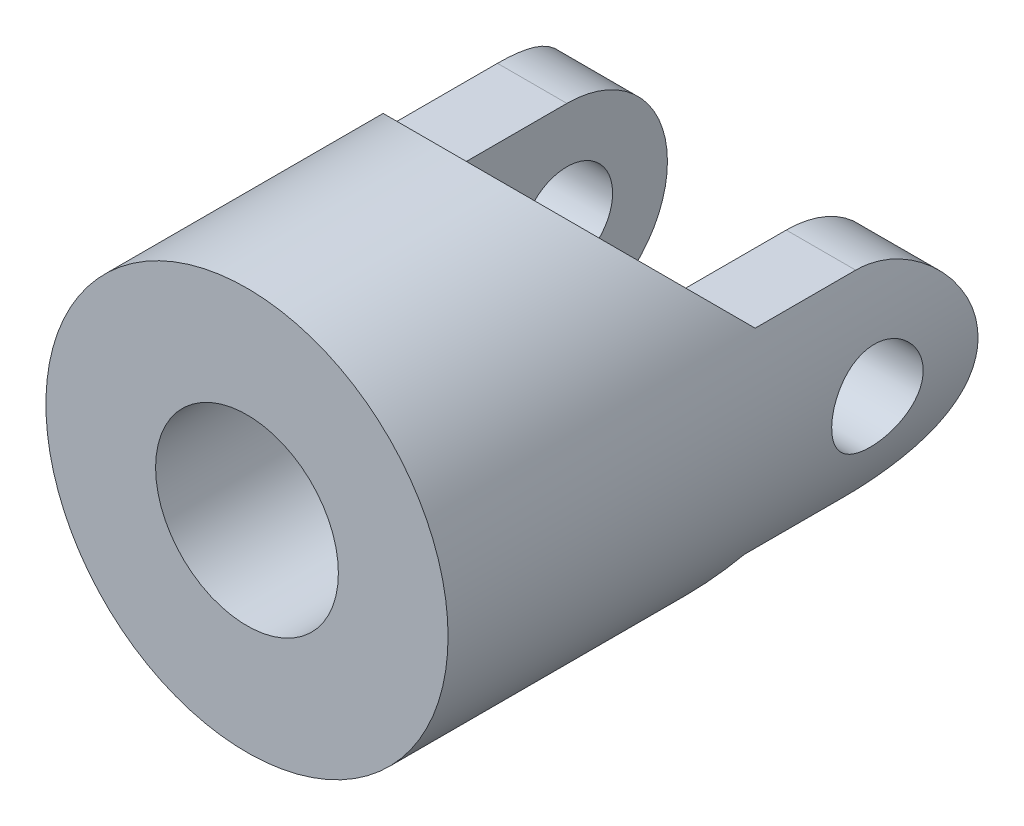
ISO-10303-21;
HEADER;
FILE_DESCRIPTION(('STEP AP214'),'2;1');
FILE_NAME('part.step','',(''),(''),'','','');
FILE_SCHEMA(('AUTOMOTIVE_DESIGN { 1 0 10303 214 1 1 1 1 }'));
ENDSEC;
DATA;
#1=APPLICATION_CONTEXT('core data for automotive mechanical design processes');
#2=APPLICATION_PROTOCOL_DEFINITION('international standard','automotive_design',2000,#1);
#3=PRODUCT_CONTEXT('',#1,'mechanical');
#4=PRODUCT('Part','Part','',(#3));
#5=PRODUCT_RELATED_PRODUCT_CATEGORY('part','',(#4));
#6=PRODUCT_DEFINITION_FORMATION('','',#4);
#7=PRODUCT_DEFINITION_CONTEXT('part definition',#1,'design');
#8=PRODUCT_DEFINITION('design','',#6,#7);
#9=PRODUCT_DEFINITION_SHAPE('','',#8);
#10=(LENGTH_UNIT() NAMED_UNIT(*) SI_UNIT(.MILLI.,.METRE.));
#11=(NAMED_UNIT(*) PLANE_ANGLE_UNIT() SI_UNIT($,.RADIAN.));
#12=(NAMED_UNIT(*) SI_UNIT($,.STERADIAN.) SOLID_ANGLE_UNIT());
#13=UNCERTAINTY_MEASURE_WITH_UNIT(LENGTH_MEASURE(1.E-05),#10,'distance_accuracy_value','');
#14=(GEOMETRIC_REPRESENTATION_CONTEXT(3) GLOBAL_UNCERTAINTY_ASSIGNED_CONTEXT((#13)) GLOBAL_UNIT_ASSIGNED_CONTEXT((#10,
#11,#12)) REPRESENTATION_CONTEXT('',''));
#15=CARTESIAN_POINT('',(0.,0.,0.));
#16=DIRECTION('',(0.,0.,1.));
#17=DIRECTION('',(1.,0.,0.));
#18=AXIS2_PLACEMENT_3D('',#15,#16,#17);
#19=CARTESIAN_POINT('',(0.,0.,29.));
#20=DIRECTION('',(0.,0.,-1.));
#21=DIRECTION('',(-1.,0.,0.));
#22=AXIS2_PLACEMENT_3D('',#19,#20,#21);
#23=CYLINDRICAL_SURFACE('',#22,11.);
#24=CARTESIAN_POINT('',(0.,0.,29.));
#25=DIRECTION('',(0.,0.,1.));
#26=DIRECTION('',(1.,0.,0.));
#27=AXIS2_PLACEMENT_3D('',#24,#25,#26);
#28=CIRCLE('',#27,11.);
#29=CARTESIAN_POINT('',(11.,0.,29.));
#30=VERTEX_POINT('',#29);
#31=EDGE_CURVE('E179',#30,#30,#28,.T.);
#32=ORIENTED_EDGE('',*,*,#31,.F.);
#33=EDGE_LOOP('',(#32));
#34=FACE_BOUND('',#33,.T.);
#35=DIRECTION('',(0.,0.,-1.));
#36=VECTOR('',#35,1.);
#37=CARTESIAN_POINT('',(-9.79795897113271,5.,29.));
#38=LINE('',#37,#36);
#39=CARTESIAN_POINT('',(-9.79795897113271,5.,5.50000000000001));
#40=VERTEX_POINT('',#39);
#41=CARTESIAN_POINT('',(-9.79795897113269,5.,11.));
#42=VERTEX_POINT('',#41);
#43=EDGE_CURVE('E175',#40,#42,#38,.F.);
#44=ORIENTED_EDGE('',*,*,#43,.F.);
#45=CARTESIAN_POINT('',(-9.79795897113271,5.,5.5));
#46=CARTESIAN_POINT('',(-9.79791901495704,5.00002536693657,5.35375448692618));
#47=CARTESIAN_POINT('',(-9.80093435512819,4.99416817861175,5.20752638082429));
#48=CARTESIAN_POINT('',(-9.81277951302113,4.97088215506113,4.91630510558793));
#49=CARTESIAN_POINT('',(-9.82160631764494,4.95345931629522,4.77131133592007));
#50=CARTESIAN_POINT('',(-9.84472045361108,4.90735159158612,4.48433011762093));
#51=CARTESIAN_POINT('',(-9.85898003581049,4.87872391691164,4.34233119912725));
#52=CARTESIAN_POINT('',(-9.89243088582325,4.81053645935873,4.06157315381756));
#53=CARTESIAN_POINT('',(-9.91162261297716,4.77097565823039,3.9228143300718));
#54=CARTESIAN_POINT('',(-9.95424066922814,4.68140372944851,3.64968436053223));
#55=CARTESIAN_POINT('',(-9.97765878065315,4.63141285283372,3.515305287167));
#56=CARTESIAN_POINT('',(-10.0280015554786,4.52137658634203,3.25139025618155));
#57=CARTESIAN_POINT('',(-10.0549275445201,4.46132739292306,3.1218561534353));
#58=CARTESIAN_POINT('',(-10.1398192078454,4.26662892993911,2.74130640074443));
#59=CARTESIAN_POINT('',(-10.2018810262926,4.11746378831441,2.49844914766621));
#60=CARTESIAN_POINT('',(-10.3344879250292,3.77289084936972,2.02374332069485));
#61=CARTESIAN_POINT('',(-10.4053228998938,3.57502224647574,1.79377659115899));
#62=CARTESIAN_POINT('',(-10.5437212272509,3.14342624253717,1.3687778516989));
#63=CARTESIAN_POINT('',(-10.6112840246141,2.90969278481333,1.17375175445627));
#64=CARTESIAN_POINT('',(-10.7058012373936,2.53059272892566,0.907521391384928));
#65=CARTESIAN_POINT('',(-10.7367467983721,2.39629328157212,0.821645318034693));
#66=CARTESIAN_POINT('',(-10.7946726215094,2.1201187682204,0.661569608717118));
#67=CARTESIAN_POINT('',(-10.8216546456735,1.97824710695397,0.587364783208756));
#68=CARTESIAN_POINT('',(-10.8707064729916,1.68801380817859,0.451409936999834));
#69=CARTESIAN_POINT('',(-10.8927809274941,1.53965847682705,0.389648128178017));
#70=CARTESIAN_POINT('',(-10.9312326033996,1.23746835060458,0.27917028695496));
#71=CARTESIAN_POINT('',(-10.9476113679389,1.08363505235314,0.230450721836414));
#72=CARTESIAN_POINT('',(-10.9706154567375,0.811869404333418,0.157397441251613));
#73=CARTESIAN_POINT('',(-10.9786654638073,0.694866193159206,0.130014367818682));
#74=CARTESIAN_POINT('',(-10.9910468923933,0.45914376663639,0.0829452088339087));
#75=CARTESIAN_POINT('',(-10.9953791200909,0.340424928993014,0.0632574550961064));
#76=CARTESIAN_POINT('',(-11.0001785420311,0.101664552980263,0.0316805119713146));
#77=CARTESIAN_POINT('',(-11.0006389090476,-0.0183789482440031,0.0198051320519487));
#78=CARTESIAN_POINT('',(-10.997612691706,-0.258977433874118,0.00395752416385313));
#79=CARTESIAN_POINT('',(-10.9941247664844,-0.379532578181629,-1.20176716498572E-05));
#80=CARTESIAN_POINT('',(-10.988630487918,-0.500000000000001,0.));
#81=B_SPLINE_CURVE_WITH_KNOTS('',3,(#45,#46,#47,#48,#49,#50,#51,#52,#53,#54,#55,#56,#57,#58,#59,
#60,#61,#62,#63,#64,#65,#66,#67,#68,#69,#70,#71,#72,#73,#74,#75,#76,#77,#78,#79,#80),
.UNSPECIFIED.,.F.,.F.,(4,2,2,2,2,2,2,2,2,2,2,2,2,2,2,2,2,4),(0.,0.438560770792847,
0.876894337743148,1.31301839758024,1.74918308925664,2.18450867554247,2.61999925293241,
3.49131517536416,4.42208376225702,5.35300970608816,5.83962820390414,6.32602971467,
6.81196823443102,7.29777499584993,7.65878405657226,8.01971481454474,8.38128186618592,
8.74297174499438),.UNSPECIFIED.);
#82=CARTESIAN_POINT('',(-10.988630487918,-0.500000000000004,0.));
#83=VERTEX_POINT('',#82);
#84=EDGE_CURVE('E228',#40,#83,#81,.T.);
#85=ORIENTED_EDGE('',*,*,#84,.T.);
#86=CARTESIAN_POINT('',(-10.988630487918,-0.500000000000004,0.));
#87=CARTESIAN_POINT('',(-10.981968021013,-0.647026486825968,-2.46735024511314E-05));
#88=CARTESIAN_POINT('',(-10.972301902938,-0.793897223235127,0.0058942229554735));
#89=CARTESIAN_POINT('',(-10.9472203288064,-1.08614141915329,0.029365375815211));
#90=CARTESIAN_POINT('',(-10.9318076926036,-1.23151557714831,0.0469119297271468));
#91=CARTESIAN_POINT('',(-10.8955732554246,-1.51901909889787,0.0932709149344862));
#92=CARTESIAN_POINT('',(-10.8747784031137,-1.66116089580998,0.122027570532244));
#93=CARTESIAN_POINT('',(-10.828159221419,-1.94196253606492,0.190421334915883));
#94=CARTESIAN_POINT('',(-10.8023344508309,-2.08062207275235,0.230059398300527));
#95=CARTESIAN_POINT('',(-10.746216602144,-2.35333187275217,0.319679342973049));
#96=CARTESIAN_POINT('',(-10.7159317924615,-2.48739011110855,0.369642150999976));
#97=CARTESIAN_POINT('',(-10.6514525596963,-2.75044207128096,0.479457474736101));
#98=CARTESIAN_POINT('',(-10.6172566756679,-2.87943387624802,0.539313689777014));
#99=CARTESIAN_POINT('',(-10.5097259870652,-3.25796477113642,0.733036132312776));
#100=CARTESIAN_POINT('',(-10.4314568598866,-3.49901840396594,0.881042542696296));
#101=CARTESIAN_POINT('',(-10.2618451109196,-3.97008806405857,1.22226931156325));
#102=CARTESIAN_POINT('',(-10.1699702395628,-4.19813692645696,1.41793670203965));
#103=CARTESIAN_POINT('',(-10.0317998071262,-4.51401052180838,1.73699814480322));
#104=CARTESIAN_POINT('',(-9.98564517706542,-4.61500740478636,1.84771368648627));
#105=CARTESIAN_POINT('',(-9.89424210515607,-4.80784150839262,2.07728693669595));
#106=CARTESIAN_POINT('',(-9.84899382208696,-4.89967713512011,2.19614605601803));
#107=CARTESIAN_POINT('',(-9.75705631937896,-5.08044597622713,2.45109641677957));
#108=CARTESIAN_POINT('',(-9.71053161551891,-5.16858911540188,2.58780823858284));
#109=CARTESIAN_POINT('',(-9.62130282353169,-5.33284779687719,2.86938591839545));
#110=CARTESIAN_POINT('',(-9.57859696225822,-5.40896893388637,3.014247940704));
#111=CARTESIAN_POINT('',(-9.4985645366606,-5.54830760523412,3.31107088780564));
#112=CARTESIAN_POINT('',(-9.46122619037266,-5.61155353244038,3.46301526389547));
#113=CARTESIAN_POINT('',(-9.39330292576434,-5.72452743953693,3.77328573660333));
#114=CARTESIAN_POINT('',(-9.36271540114178,-5.77426063803093,3.93160934236492));
#115=CARTESIAN_POINT('',(-9.31745889917455,-5.84689726302115,4.20597993794358));
#116=CARTESIAN_POINT('',(-9.30075439822387,-5.873389124653,4.32075507992826));
#117=CARTESIAN_POINT('',(-9.27178239425065,-5.91901847949776,4.55228979391347));
#118=CARTESIAN_POINT('',(-9.25951362294048,-5.93815807500803,4.66904878866743));
#119=CARTESIAN_POINT('',(-9.23969468855725,-5.96895291038192,4.90444145121145));
#120=CARTESIAN_POINT('',(-9.23216414464764,-5.98057703700029,5.0230808551016));
#121=CARTESIAN_POINT('',(-9.22207550474181,-5.9961102742142,5.2611428330243));
#122=CARTESIAN_POINT('',(-9.21952035002263,-6.0000148212837,5.38056582846288));
#123=CARTESIAN_POINT('',(-9.21954445729289,-6.,5.5));
#124=B_SPLINE_CURVE_WITH_KNOTS('',3,(#86,#87,#88,#89,#90,#91,#92,#93,#94,#95,#96,#97,#98,#99,
#100,#101,#102,#103,#104,#105,#106,#107,#108,#109,#110,#111,#112,#113,#114,#115,#116,#117,#118,
#119,#120,#121,#122,#123),.UNSPECIFIED.,.F.,.F.,(4,2,2,2,2,2,2,2,2,2,2,2,2,2,2,2,2,2,4),(0.,
0.441353657171415,0.882491023658467,1.32146096999993,1.76046943839308,2.19867404706675,
2.63704288094201,3.51391108569238,4.45242141646075,4.9224508605191,5.39256193950139,
5.89947679133331,6.40615503937431,6.91170354104699,7.41705652192578,7.77367365750013,
8.13018874639893,8.48817047625676,8.84636376829054),.UNSPECIFIED.);
#125=CARTESIAN_POINT('',(-9.21954445729288,-6.,5.50000000000001));
#126=VERTEX_POINT('',#125);
#127=EDGE_CURVE('E222',#83,#126,#124,.T.);
#128=ORIENTED_EDGE('',*,*,#127,.T.);
#129=DIRECTION('',(0.,0.,-1.));
#130=VECTOR('',#129,1.);
#131=CARTESIAN_POINT('',(-9.21954445729288,-6.,29.));
#132=LINE('',#131,#130);
#133=CARTESIAN_POINT('',(-9.21954445729287,-6.,11.));
#134=VERTEX_POINT('',#133);
#135=EDGE_CURVE('E172',#134,#126,#132,.T.);
#136=ORIENTED_EDGE('',*,*,#135,.F.);
#137=CARTESIAN_POINT('',(0.,0.,5.00000000000005));
#138=DIRECTION('',(0.,-0.707106781186546,-0.707106781186549));
#139=DIRECTION('',(0.,0.707106781186549,-0.707106781186546));
#140=AXIS2_PLACEMENT_3D('',#137,#138,#139);
#141=ELLIPSE('',#140,15.556349186104,11.);
#142=CARTESIAN_POINT('',(9.21954445729289,-6.,11.));
#143=VERTEX_POINT('',#142);
#144=EDGE_CURVE('E182',#143,#134,#141,.T.);
#145=ORIENTED_EDGE('',*,*,#144,.F.);
#146=DIRECTION('',(0.,0.,-1.));
#147=VECTOR('',#146,1.);
#148=CARTESIAN_POINT('',(9.21954445729288,-6.,29.));
#149=LINE('',#148,#147);
#150=CARTESIAN_POINT('',(9.21954445729288,-6.,5.50000000000001));
#151=VERTEX_POINT('',#150);
#152=EDGE_CURVE('E166',#151,#143,#149,.F.);
#153=ORIENTED_EDGE('',*,*,#152,.F.);
#154=CARTESIAN_POINT('',(9.21954445729288,-6.,5.5));
#155=CARTESIAN_POINT('',(9.21949745252943,-6.00002900746917,5.35844650521414));
#156=CARTESIAN_POINT('',(9.22309934976338,-5.99453666780138,5.21691663271529));
#157=CARTESIAN_POINT('',(9.23724910092051,-5.97273264809567,4.9351423967424));
#158=CARTESIAN_POINT('',(9.24779189796075,-5.95642884482774,4.79489717268762));
#159=CARTESIAN_POINT('',(9.27538035135516,-5.91336855877127,4.51764766279104));
#160=CARTESIAN_POINT('',(9.29238222264703,-5.88668242746403,4.38062801122878));
#161=CARTESIAN_POINT('',(9.33228061686796,-5.82322509401676,4.10981408309997));
#162=CARTESIAN_POINT('',(9.35517796823375,-5.78645247446931,3.9760202627214));
#163=CARTESIAN_POINT('',(9.40605412164269,-5.70337652922192,3.71286396815222));
#164=CARTESIAN_POINT('',(9.43401805579212,-5.65710103805909,3.58348981096273));
#165=CARTESIAN_POINT('',(9.49425297529968,-5.55541677809814,3.32939875554668));
#166=CARTESIAN_POINT('',(9.52652562235972,-5.50000448364515,3.20468367801342));
#167=CARTESIAN_POINT('',(9.62862016772359,-5.32058308542793,2.83804337466108));
#168=CARTESIAN_POINT('',(9.70367298148632,-5.18346094813861,2.60384675513947));
#169=CARTESIAN_POINT('',(9.86840258090261,-4.86313696178404,2.13837668605984));
#170=CARTESIAN_POINT('',(9.95879163810767,-4.67676931275557,1.90955648720308));
#171=CARTESIAN_POINT('',(10.1399283916986,-4.26981959415204,1.48441139063383));
#172=CARTESIAN_POINT('',(10.2306762271062,-4.04922266226001,1.28810068541474));
#173=CARTESIAN_POINT('',(10.3655466459146,-3.68436120707404,1.01267262461045));
#174=CARTESIAN_POINT('',(10.4122261922286,-3.55058504088419,0.920652666653367));
#175=CARTESIAN_POINT('',(10.5022773525515,-3.27462861933775,0.748383511946173));
#176=CARTESIAN_POINT('',(10.5456503133892,-3.1324518280401,0.668129510292132));
#177=CARTESIAN_POINT('',(10.6279663758417,-2.84065090860849,0.520232034113863));
#178=CARTESIAN_POINT('',(10.6669138855204,-2.69103440840638,0.452575967460876));
#179=CARTESIAN_POINT('',(10.7394158068789,-2.38528799409831,0.330594989248598));
#180=CARTESIAN_POINT('',(10.7729736653933,-2.22916232392143,0.276261545687708));
#181=CARTESIAN_POINT('',(10.8275233948264,-1.94452259786368,0.19145937144126));
#182=CARTESIAN_POINT('',(10.8496777735677,-1.81700293041331,0.158378050186886));
#183=CARTESIAN_POINT('',(10.8897018218903,-1.55929308822138,0.101360443055499));
#184=CARTESIAN_POINT('',(10.9075724644684,-1.42910352721932,0.0774220797364011));
#185=CARTESIAN_POINT('',(10.9387891942091,-1.16636989174955,0.0388990998124758));
#186=CARTESIAN_POINT('',(10.9521203874137,-1.03381954011216,0.0243451365414475));
#187=CARTESIAN_POINT('',(10.9740067048015,-0.767555171832359,0.00488467049829024));
#188=CARTESIAN_POINT('',(10.9825594162334,-0.633840601893957,-1.69617657563802E-05));
#189=CARTESIAN_POINT('',(10.988630487918,-0.500000000000004,0.));
#190=B_SPLINE_CURVE_WITH_KNOTS('',3,(#154,#155,#156,#157,#158,#159,#160,#161,#162,#163,#164,
#165,#166,#167,#168,#169,#170,#171,#172,#173,#174,#175,#176,#177,#178,#179,#180,#181,#182,#183,
#184,#185,#186,#187,#188,#189),.UNSPECIFIED.,.F.,.F.,(4,2,2,2,2,2,2,2,2,2,2,2,2,2,2,2,2,4),(0.,
0.424470802660134,0.848632693315212,1.26996913027414,1.69136480604974,2.11154335469819,
2.53188442039869,3.37327651318758,4.29569260758612,5.21851034060388,5.72480163745929,
6.23088559902172,6.73646096215697,7.24171169684039,7.64210099547243,8.04239926436079,
8.44399853663665,8.8458004016128),.UNSPECIFIED.);
#191=CARTESIAN_POINT('',(10.988630487918,-0.500000000000001,0.));
#192=VERTEX_POINT('',#191);
#193=EDGE_CURVE('E199',#151,#192,#190,.T.);
#194=ORIENTED_EDGE('',*,*,#193,.T.);
#195=CARTESIAN_POINT('',(10.988630487918,-0.500000000000001,0.));
#196=CARTESIAN_POINT('',(10.9951861811526,-0.356493024519304,-2.44521712459134E-05));
#197=CARTESIAN_POINT('',(10.998879544689,-0.212863256119073,0.00561561594683252));
#198=CARTESIAN_POINT('',(11.000679086674,0.0735071514777978,0.0281046077150079));
#199=CARTESIAN_POINT('',(10.9987870217334,0.216248056071412,0.0449500060110572));
#200=CARTESIAN_POINT('',(10.9895766114363,0.49919917301931,0.0896350914115936));
#201=CARTESIAN_POINT('',(10.9822812057621,0.639417524633493,0.11742806813122));
#202=CARTESIAN_POINT('',(10.9625994296562,0.916928804969691,0.183735852970523));
#203=CARTESIAN_POINT('',(10.9502128728256,1.05422162638764,0.222251053639077));
#204=CARTESIAN_POINT('',(10.9207764183119,1.32481756087141,0.309602300359135));
#205=CARTESIAN_POINT('',(10.9037312155645,1.45812454157196,0.358427944447479));
#206=CARTESIAN_POINT('',(10.8654900694103,1.72008323540956,0.465984613326715));
#207=CARTESIAN_POINT('',(10.8442925539081,1.8487331634274,0.52471938861392));
#208=CARTESIAN_POINT('',(10.7753133671246,2.22666195520486,0.715150834398785));
#209=CARTESIAN_POINT('',(10.7221398564971,2.46796477391759,0.861089260315746));
#210=CARTESIAN_POINT('',(10.6039865760435,2.93541269245536,1.19480809946281));
#211=CARTESIAN_POINT('',(10.5385487381854,3.16019247219989,1.38431865947214));
#212=CARTESIAN_POINT('',(10.4046049285449,3.57659567041061,1.79633935289467));
#213=CARTESIAN_POINT('',(10.3360968457096,3.76819582074042,2.01887244282226));
#214=CARTESIAN_POINT('',(10.2339864051134,4.03429556006482,2.38307797362611));
#215=CARTESIAN_POINT('',(10.1988348466544,4.12209540491511,2.51480933146789));
#216=CARTESIAN_POINT('',(10.1309421199475,4.28624381872553,2.78579130745898));
#217=CARTESIAN_POINT('',(10.0981999991419,4.36259692560768,2.92503891594637));
#218=CARTESIAN_POINT('',(10.0363050212754,4.50316348012606,3.21011045679357));
#219=CARTESIAN_POINT('',(10.0071485320574,4.56738924837608,3.3559275263545));
#220=CARTESIAN_POINT('',(9.95350217206189,4.68314713985369,3.65327007594967));
#221=CARTESIAN_POINT('',(9.92900951418153,4.73468684968585,3.80479208145643));
#222=CARTESIAN_POINT('',(9.88986823698849,4.81581988756768,4.08269010008618));
#223=CARTESIAN_POINT('',(9.87423182504465,4.84773025026167,4.20825564282456));
#224=CARTESIAN_POINT('',(9.84706965513788,4.90266809755512,4.46173676822173));
#225=CARTESIAN_POINT('',(9.83554304579422,4.92569742201832,4.58965185837154));
#226=CARTESIAN_POINT('',(9.81691898257216,4.96271682854708,4.84751891443659));
#227=CARTESIAN_POINT('',(9.80983558699126,4.97667822463845,4.97747602510825));
#228=CARTESIAN_POINT('',(9.80034155962739,4.99533021271464,5.23828491608505));
#229=CARTESIAN_POINT('',(9.79793318100375,5.00001633443309,5.36913709730409));
#230=CARTESIAN_POINT('',(9.79795897113271,5.,5.5));
#231=B_SPLINE_CURVE_WITH_KNOTS('',3,(#195,#196,#197,#198,#199,#200,#201,#202,#203,#204,#205,
#206,#207,#208,#209,#210,#211,#212,#213,#214,#215,#216,#217,#218,#219,#220,#221,#222,#223,#224,
#225,#226,#227,#228,#229,#230),.UNSPECIFIED.,.F.,.F.,(4,2,2,2,2,2,2,2,2,2,2,2,2,2,2,2,2,4),(0.,
0.43081896515463,0.861502452686735,1.29036789527557,1.71924904102391,2.14769954842482,
2.57631258489893,3.43339765538748,4.33342804501993,5.23408707219847,5.72008706690133,
6.20589388033135,6.69120445736646,7.17622409659043,7.56735052744143,7.95839588596672,
8.3506723498338,8.74313782737661),.UNSPECIFIED.);
#232=CARTESIAN_POINT('',(9.79795897113271,5.,5.50000000000001));
#233=VERTEX_POINT('',#232);
#234=EDGE_CURVE('E192',#192,#233,#231,.T.);
#235=ORIENTED_EDGE('',*,*,#234,.T.);
#236=DIRECTION('',(0.,0.,-1.));
#237=VECTOR('',#236,1.);
#238=CARTESIAN_POINT('',(9.79795897113271,5.,29.));
#239=LINE('',#238,#237);
#240=CARTESIAN_POINT('',(9.79795897113272,5.,11.));
#241=VERTEX_POINT('',#240);
#242=EDGE_CURVE('E177',#241,#233,#239,.T.);
#243=ORIENTED_EDGE('',*,*,#242,.F.);
#244=CARTESIAN_POINT('',(0.,0.,6.00000000000004));
#245=DIRECTION('',(0.,0.707106781186546,-0.707106781186549));
#246=DIRECTION('',(0.,-0.707106781186549,-0.707106781186546));
#247=AXIS2_PLACEMENT_3D('',#244,#245,#246);
#248=ELLIPSE('',#247,15.556349186104,11.);
#249=EDGE_CURVE('E185',#42,#241,#248,.T.);
#250=ORIENTED_EDGE('',*,*,#249,.F.);
#251=EDGE_LOOP('',(#44,#85,#128,#136,#145,#153,#194,#235,#243,#250));
#252=FACE_BOUND('',#251,.T.);
#253=CARTESIAN_POINT('',(11.,0.,3.05051025721682));
#254=CARTESIAN_POINT('',(10.999997845609,0.13638521322755,3.07835447624825));
#255=CARTESIAN_POINT('',(10.9974392075213,0.270494118822884,3.11762995966496));
#256=CARTESIAN_POINT('',(10.9879837812959,0.53024060270952,3.21789209522683));
#257=CARTESIAN_POINT('',(10.9810836653786,0.655871600746531,3.27889538634312));
#258=CARTESIAN_POINT('',(10.9641866199879,0.894970780465268,3.42073216769461));
#259=CARTESIAN_POINT('',(10.9541929913484,1.00845175355937,3.50154450228511));
#260=CARTESIAN_POINT('',(10.9326166549788,1.22035140135602,3.68075590419845));
#261=CARTESIAN_POINT('',(10.921034040301,1.31877095735252,3.77915394179199));
#262=CARTESIAN_POINT('',(10.8977530853023,1.4991236916079,3.99227305771748));
#263=CARTESIAN_POINT('',(10.8860551932184,1.58082640694563,4.10718934996515));
#264=CARTESIAN_POINT('',(10.8643276898795,1.72384369152116,4.34922747990389));
#265=CARTESIAN_POINT('',(10.8542980859141,1.78515817167297,4.47634937092396));
#266=CARTESIAN_POINT('',(10.837295821158,1.8856392617278,4.73937168743888));
#267=CARTESIAN_POINT('',(10.8303253066046,1.92479032748798,4.87527819971442));
#268=CARTESIAN_POINT('',(10.8204323949046,1.97965470378892,5.15188114723859));
#269=CARTESIAN_POINT('',(10.8175095514568,1.9953705983359,5.29257705264965));
#270=CARTESIAN_POINT('',(10.8161346753702,2.00280867940348,5.5724844472511));
#271=CARTESIAN_POINT('',(10.8176156329529,1.99489048360066,5.71168616551611));
#272=CARTESIAN_POINT('',(10.8246984108154,1.95608950654861,5.98673858859496));
#273=CARTESIAN_POINT('',(10.8303002095592,1.9252068453139,6.1225893109176));
#274=CARTESIAN_POINT('',(10.8448392335511,1.84153315332264,6.38677807215938));
#275=CARTESIAN_POINT('',(10.8537678171819,1.78879884470187,6.51513458735654));
#276=CARTESIAN_POINT('',(10.8737594880475,1.66294813510297,6.76125484080646));
#277=CARTESIAN_POINT('',(10.8848227934838,1.58982965020608,6.8790174943967));
#278=CARTESIAN_POINT('',(10.9077648167143,1.4239928635149,7.10246417049782));
#279=CARTESIAN_POINT('',(10.919653131492,1.33100220571664,7.20794515518292));
#280=CARTESIAN_POINT('',(10.9424215188916,1.12860995603469,7.40191407895685));
#281=CARTESIAN_POINT('',(10.9533015523802,1.019207727621,7.49040135863366));
#282=CARTESIAN_POINT('',(10.9724808561063,0.786357531334131,7.64829457855729));
#283=CARTESIAN_POINT('',(10.9807665866049,0.662840320295742,7.7176001981776));
#284=CARTESIAN_POINT('',(10.9932678120545,0.405715836074623,7.83444060012993));
#285=CARTESIAN_POINT('',(10.9974838286178,0.272109858328833,7.8819781720454));
#286=CARTESIAN_POINT('',(11.0008214035864,0.000969190405671018,7.95323382609147));
#287=CARTESIAN_POINT('',(11.000025268536,-0.13646531631707,7.9773292742342));
#288=CARTESIAN_POINT('',(10.9931048596125,-0.413286598855688,8.00235712780213));
#289=CARTESIAN_POINT('',(10.9869810502561,-0.552673203426903,8.00329155241339));
#290=CARTESIAN_POINT('',(10.9696775108347,-0.827597634667619,7.98222717762792));
#291=CARTESIAN_POINT('',(10.9585622454837,-0.963161813001906,7.96051625583142));
#292=CARTESIAN_POINT('',(10.9319953568615,-1.22852426442625,7.89539604710013));
#293=CARTESIAN_POINT('',(10.9165433794917,-1.35832206568072,7.85198498809263));
#294=CARTESIAN_POINT('',(10.8822094863211,-1.61057961964074,7.74403830345168));
#295=CARTESIAN_POINT('',(10.8632811314086,-1.73290585268913,7.67920580667272));
#296=CARTESIAN_POINT('',(10.8237022553466,-1.96503297760119,7.53044098024268));
#297=CARTESIAN_POINT('',(10.8030514275297,-2.07483163079168,7.44650524485159));
#298=CARTESIAN_POINT('',(10.7612667314845,-2.28179440503088,7.25931102440562));
#299=CARTESIAN_POINT('',(10.7401342098365,-2.37855749574643,7.15560826908573));
#300=CARTESIAN_POINT('',(10.6999281368675,-2.55335152365503,6.93309557931042));
#301=CARTESIAN_POINT('',(10.6808546381695,-2.63138198215676,6.81428525891682));
#302=CARTESIAN_POINT('',(10.6466886542689,-2.76638580694517,6.56471421024587));
#303=CARTESIAN_POINT('',(10.6315957918133,-2.82336116887183,6.43395461600827));
#304=CARTESIAN_POINT('',(10.6070156788768,-2.91435465244451,6.16418455274395));
#305=CARTESIAN_POINT('',(10.5975269967762,-2.94837863746649,6.02517620090333));
#306=CARTESIAN_POINT('',(10.5854229794632,-2.99153976208597,5.7476283673067));
#307=CARTESIAN_POINT('',(10.5825972681662,-3.00143896711196,5.60921642189325));
#308=CARTESIAN_POINT('',(10.583508881186,-2.99822356288687,5.33269237958525));
#309=CARTESIAN_POINT('',(10.5872454038863,-2.98511176456851,5.19458024813005));
#310=CARTESIAN_POINT('',(10.6007294677011,-2.93685765454005,4.92551934111751));
#311=CARTESIAN_POINT('',(10.6103522757705,-2.90217224754701,4.79448177376608));
#312=CARTESIAN_POINT('',(10.6345194918067,-2.81232017092692,4.54011700208272));
#313=CARTESIAN_POINT('',(10.6490644424918,-2.75715124270994,4.41679064977108));
#314=CARTESIAN_POINT('',(10.6820040711091,-2.62666869503394,4.17860333875161));
#315=CARTESIAN_POINT('',(10.7004700161672,-2.55097375220452,4.06396138989649));
#316=CARTESIAN_POINT('',(10.7393325260586,-2.38206455615244,3.84877288335473));
#317=CARTESIAN_POINT('',(10.7597294318829,-2.28884720574938,3.74822882303998));
#318=CARTESIAN_POINT('',(10.8013074941194,-2.08398899562686,3.56070150050589));
#319=CARTESIAN_POINT('',(10.8224926214188,-1.97184844995185,3.47426416124911));
#320=CARTESIAN_POINT('',(10.863081124014,-1.73434789197153,3.3213926845076));
#321=CARTESIAN_POINT('',(10.8824842101232,-1.60898574115378,3.25496178966089));
#322=CARTESIAN_POINT('',(10.9178861411746,-1.34801487459564,3.14393521400939));
#323=CARTESIAN_POINT('',(10.9338743731785,-1.21237593979363,3.09940706113009));
#324=CARTESIAN_POINT('',(10.9610629752306,-0.93511529692856,3.03404756082056));
#325=CARTESIAN_POINT('',(10.9722675956003,-0.793499023312404,3.01319514962867));
#326=CARTESIAN_POINT('',(10.987169194317,-0.542255898130256,2.99797802485301));
#327=CARTESIAN_POINT('',(10.9920146380483,-0.432978256659561,2.9985182451607));
#328=CARTESIAN_POINT('',(10.9984308238557,-0.215333695507557,3.01386553893774));
#329=CARTESIAN_POINT('',(11.000001689686,-0.106966741563357,3.0286720732181));
#330=CARTESIAN_POINT('',(11.,0.,3.05051025721682));
#331=B_SPLINE_CURVE_WITH_KNOTS('',3,(#253,#254,#255,#256,#257,#258,#259,#260,#261,#262,#263,
#264,#265,#266,#267,#268,#269,#270,#271,#272,#273,#274,#275,#276,#277,#278,#279,#280,#281,#282,
#283,#284,#285,#286,#287,#288,#289,#290,#291,#292,#293,#294,#295,#296,#297,#298,#299,#300,#301,
#302,#303,#304,#305,#306,#307,#308,#309,#310,#311,#312,#313,#314,#315,#316,#317,#318,#319,#320,
#321,#322,#323,#324,#325,#326,#327,#328,#329,#330),.UNSPECIFIED.,.T.,.F.,(4,2,2,2,2,2,2,2,2,2,2,
2,2,2,2,2,2,2,2,2,2,2,2,2,2,2,2,2,2,2,2,2,2,2,2,2,2,2,4),(0.,0.417193560244907,0.83470729312768,
1.2517770580714,1.66882240952812,2.09127855592384,2.51373654820925,2.93649046229911,
3.3591977592966,3.77550607074456,4.19181220654024,4.60704440503058,5.02231906919001,
5.44369919591721,5.86509567028598,6.28865611454459,6.7121622641735,7.1287321952012,
7.54526580938998,7.95656805746039,8.36790389870954,8.78519773462465,9.20256602436172,
9.63074738543135,10.0589396870294,10.4870913933746,10.915133678567,11.3294686782071,
11.7437530678532,12.1495488687702,12.55538942755,12.9693580455887,13.3833999037433,
13.810877459721,14.2384242638803,14.6672810939384,15.0957560802516,15.4229728018863,
15.7501771569959),.UNSPECIFIED.);
#332=CARTESIAN_POINT('',(11.,0.,3.05051025721682));
#333=VERTEX_POINT('',#332);
#334=EDGE_CURVE('E235',#333,#333,#331,.T.);
#335=ORIENTED_EDGE('',*,*,#334,.F.);
#336=EDGE_LOOP('',(#335));
#337=FACE_BOUND('',#336,.T.);
#338=CARTESIAN_POINT('',(-11.,0.,7.94948974278318));
#339=CARTESIAN_POINT('',(-10.999997845609,0.136385213227551,7.92164552375175));
#340=CARTESIAN_POINT('',(-10.9974392075213,0.270494118822884,7.88237004033504));
#341=CARTESIAN_POINT('',(-10.9879837812959,0.530240602709521,7.78210790477317));
#342=CARTESIAN_POINT('',(-10.9810836653786,0.655871600746531,7.72110461365688));
#343=CARTESIAN_POINT('',(-10.9641866199879,0.894970780465269,7.57926783230539));
#344=CARTESIAN_POINT('',(-10.9541929913484,1.00845175355937,7.49845549771489));
#345=CARTESIAN_POINT('',(-10.9326166549788,1.22035140135602,7.31924409580155));
#346=CARTESIAN_POINT('',(-10.921034040301,1.31877095735252,7.22084605820801));
#347=CARTESIAN_POINT('',(-10.8977530853023,1.4991236916079,7.00772694228252));
#348=CARTESIAN_POINT('',(-10.8860551932184,1.58082640694563,6.89281065003485));
#349=CARTESIAN_POINT('',(-10.8643276898795,1.72384369152117,6.65077252009611));
#350=CARTESIAN_POINT('',(-10.8542980859141,1.78515817167298,6.52365062907604));
#351=CARTESIAN_POINT('',(-10.837295821158,1.8856392617278,6.26062831256112));
#352=CARTESIAN_POINT('',(-10.8303253066046,1.92479032748798,6.12472180028558));
#353=CARTESIAN_POINT('',(-10.8204323949046,1.97965470378892,5.84811885276141));
#354=CARTESIAN_POINT('',(-10.8175095514568,1.99537059833591,5.70742294735035));
#355=CARTESIAN_POINT('',(-10.8161346753702,2.00280867940348,5.4275155527489));
#356=CARTESIAN_POINT('',(-10.8176156329529,1.99489048360066,5.28831383448389));
#357=CARTESIAN_POINT('',(-10.8246984108154,1.95608950654861,5.01326141140504));
#358=CARTESIAN_POINT('',(-10.8303002095592,1.9252068453139,4.8774106890824));
#359=CARTESIAN_POINT('',(-10.8448392335511,1.84153315332264,4.61322192784062));
#360=CARTESIAN_POINT('',(-10.8537678171819,1.78879884470187,4.48486541264346));
#361=CARTESIAN_POINT('',(-10.8737594880475,1.66294813510297,4.23874515919354));
#362=CARTESIAN_POINT('',(-10.8848227934838,1.58982965020608,4.1209825056033));
#363=CARTESIAN_POINT('',(-10.9077648167143,1.42399286351491,3.89753582950218));
#364=CARTESIAN_POINT('',(-10.919653131492,1.33100220571665,3.79205484481708));
#365=CARTESIAN_POINT('',(-10.9424215188916,1.12860995603469,3.59808592104315));
#366=CARTESIAN_POINT('',(-10.9533015523802,1.01920772762101,3.50959864136634));
#367=CARTESIAN_POINT('',(-10.9724808561063,0.786357531334134,3.35170542144271));
#368=CARTESIAN_POINT('',(-10.9807665866049,0.662840320295746,3.28239980182241));
#369=CARTESIAN_POINT('',(-10.9932678120545,0.405715836074627,3.16555939987007));
#370=CARTESIAN_POINT('',(-10.9974838286178,0.272109858328837,3.1180218279546));
#371=CARTESIAN_POINT('',(-11.0008214035864,0.000969190405674595,3.04676617390853));
#372=CARTESIAN_POINT('',(-11.000025268536,-0.136465316317067,3.0226707257658));
#373=CARTESIAN_POINT('',(-10.9931048596125,-0.413286598855685,2.99764287219787));
#374=CARTESIAN_POINT('',(-10.9869810502561,-0.5526732034269,2.99670844758661));
#375=CARTESIAN_POINT('',(-10.9696775108347,-0.827597634667615,3.01777282237208));
#376=CARTESIAN_POINT('',(-10.9585622454837,-0.963161813001903,3.03948374416858));
#377=CARTESIAN_POINT('',(-10.9319953568615,-1.22852426442624,3.10460395289987));
#378=CARTESIAN_POINT('',(-10.9165433794917,-1.35832206568071,3.14801501190737));
#379=CARTESIAN_POINT('',(-10.8822094863211,-1.61057961964073,3.25596169654832));
#380=CARTESIAN_POINT('',(-10.8632811314086,-1.73290585268912,3.32079419332728));
#381=CARTESIAN_POINT('',(-10.8237022553466,-1.96503297760118,3.46955901975731));
#382=CARTESIAN_POINT('',(-10.8030514275297,-2.07483163079168,3.55349475514841));
#383=CARTESIAN_POINT('',(-10.7612667314845,-2.28179440503088,3.74068897559437));
#384=CARTESIAN_POINT('',(-10.7401342098365,-2.37855749574642,3.84439173091427));
#385=CARTESIAN_POINT('',(-10.6999281368675,-2.55335152365503,4.06690442068958));
#386=CARTESIAN_POINT('',(-10.6808546381695,-2.63138198215675,4.18571474108318));
#387=CARTESIAN_POINT('',(-10.6466886542689,-2.76638580694517,4.43528578975413));
#388=CARTESIAN_POINT('',(-10.6315957918133,-2.82336116887183,4.56604538399173));
#389=CARTESIAN_POINT('',(-10.6070156788768,-2.91435465244451,4.83581544725604));
#390=CARTESIAN_POINT('',(-10.5975269967762,-2.94837863746648,4.97482379909667));
#391=CARTESIAN_POINT('',(-10.5854229794632,-2.99153976208597,5.2523716326933));
#392=CARTESIAN_POINT('',(-10.5825972681662,-3.00143896711196,5.39078357810675));
#393=CARTESIAN_POINT('',(-10.583508881186,-2.99822356288687,5.66730762041475));
#394=CARTESIAN_POINT('',(-10.5872454038863,-2.98511176456851,5.80541975186995));
#395=CARTESIAN_POINT('',(-10.6007294677011,-2.93685765454005,6.07448065888249));
#396=CARTESIAN_POINT('',(-10.6103522757705,-2.902172247547,6.20551822623392));
#397=CARTESIAN_POINT('',(-10.6345194918067,-2.81232017092692,6.45988299791728));
#398=CARTESIAN_POINT('',(-10.6490644424918,-2.75715124270994,6.58320935022892));
#399=CARTESIAN_POINT('',(-10.6820040711091,-2.62666869503394,6.82139666124839));
#400=CARTESIAN_POINT('',(-10.7004700161672,-2.55097375220452,6.93603861010351));
#401=CARTESIAN_POINT('',(-10.7393325260586,-2.38206455615244,7.15122711664527));
#402=CARTESIAN_POINT('',(-10.7597294318829,-2.28884720574938,7.25177117696002));
#403=CARTESIAN_POINT('',(-10.8013074941194,-2.08398899562686,7.43929849949411));
#404=CARTESIAN_POINT('',(-10.8224926214188,-1.97184844995185,7.52573583875089));
#405=CARTESIAN_POINT('',(-10.863081124014,-1.73434789197153,7.6786073154924));
#406=CARTESIAN_POINT('',(-10.8824842101232,-1.60898574115378,7.74503821033911));
#407=CARTESIAN_POINT('',(-10.9178861411746,-1.34801487459564,7.85606478599061));
#408=CARTESIAN_POINT('',(-10.9338743731785,-1.21237593979363,7.90059293886991));
#409=CARTESIAN_POINT('',(-10.9610629752306,-0.935115296928559,7.96595243917944));
#410=CARTESIAN_POINT('',(-10.9722675956003,-0.793499023312402,7.98680485037133));
#411=CARTESIAN_POINT('',(-10.987169194317,-0.542255898130255,8.00202197514699));
#412=CARTESIAN_POINT('',(-10.9920146380483,-0.43297825665956,8.0014817548393));
#413=CARTESIAN_POINT('',(-10.9984308238557,-0.215333695507556,7.98613446106226));
#414=CARTESIAN_POINT('',(-11.000001689686,-0.106966741563356,7.9713279267819));
#415=CARTESIAN_POINT('',(-11.,0.,7.94948974278318));
#416=B_SPLINE_CURVE_WITH_KNOTS('',3,(#338,#339,#340,#341,#342,#343,#344,#345,#346,#347,#348,
#349,#350,#351,#352,#353,#354,#355,#356,#357,#358,#359,#360,#361,#362,#363,#364,#365,#366,#367,
#368,#369,#370,#371,#372,#373,#374,#375,#376,#377,#378,#379,#380,#381,#382,#383,#384,#385,#386,
#387,#388,#389,#390,#391,#392,#393,#394,#395,#396,#397,#398,#399,#400,#401,#402,#403,#404,#405,
#406,#407,#408,#409,#410,#411,#412,#413,#414,#415),.UNSPECIFIED.,.T.,.F.,(4,2,2,2,2,2,2,2,2,2,2,
2,2,2,2,2,2,2,2,2,2,2,2,2,2,2,2,2,2,2,2,2,2,2,2,2,2,2,4),(0.,0.417193560244906,0.83470729312768,
1.2517770580714,1.66882240952812,2.09127855592384,2.51373654820925,2.93649046229911,
3.3591977592966,3.77550607074456,4.19181220654024,4.60704440503057,5.02231906919001,
5.44369919591721,5.86509567028598,6.28865611454459,6.71216226417349,7.1287321952012,
7.54526580938998,7.95656805746039,8.36790389870954,8.78519773462465,9.20256602436171,
9.63074738543134,10.0589396870294,10.4870913933746,10.915133678567,11.3294686782071,
11.7437530678532,12.1495488687701,12.55538942755,12.9693580455887,13.3833999037433,
13.810877459721,14.2384242638802,14.6672810939384,15.0957560802516,15.4229728018863,
15.7501771569959),.UNSPECIFIED.);
#417=CARTESIAN_POINT('',(-11.,0.,7.94948974278318));
#418=VERTEX_POINT('',#417);
#419=EDGE_CURVE('E242',#418,#418,#416,.T.);
#420=ORIENTED_EDGE('',*,*,#419,.F.);
#421=EDGE_LOOP('',(#420));
#422=FACE_BOUND('',#421,.T.);
#423=ADVANCED_FACE('F34',(#34,#252,#337,#422),#23,.T.);
#424=CARTESIAN_POINT('',(29.,-6.,0.));
#425=DIRECTION('',(0.,-1.,0.));
#426=DIRECTION('',(0.,0.,-1.));
#427=AXIS2_PLACEMENT_3D('',#424,#425,#426);
#428=PLANE('',#427);
#429=ORIENTED_EDGE('',*,*,#135,.T.);
#430=DIRECTION('',(1.,0.,0.));
#431=VECTOR('',#430,1.);
#432=CARTESIAN_POINT('',(-6.,-6.,5.5));
#433=LINE('',#432,#431);
#434=CARTESIAN_POINT('',(-6.,-6.,5.5));
#435=VERTEX_POINT('',#434);
#436=EDGE_CURVE('E295',#126,#435,#433,.T.);
#437=ORIENTED_EDGE('',*,*,#436,.T.);
#438=DIRECTION('',(0.,0.,-1.));
#439=VECTOR('',#438,1.);
#440=CARTESIAN_POINT('',(-6.,-6.,0.));
#441=LINE('',#440,#439);
#442=CARTESIAN_POINT('',(-6.,-6.,11.));
#443=VERTEX_POINT('',#442);
#444=EDGE_CURVE('E157',#443,#435,#441,.T.);
#445=ORIENTED_EDGE('',*,*,#444,.F.);
#446=DIRECTION('',(-1.,0.,0.));
#447=VECTOR('',#446,1.);
#448=CARTESIAN_POINT('',(29.,-6.,11.));
#449=LINE('',#448,#447);
#450=EDGE_CURVE('E164',#443,#134,#449,.T.);
#451=ORIENTED_EDGE('',*,*,#450,.T.);
#452=EDGE_LOOP('',(#429,#437,#445,#451));
#453=FACE_BOUND('',#452,.T.);
#454=ADVANCED_FACE('F209',(#453),#428,.T.);
#455=CARTESIAN_POINT('',(29.,5.,0.));
#456=DIRECTION('',(0.,1.,0.));
#457=DIRECTION('',(0.,0.,1.));
#458=AXIS2_PLACEMENT_3D('',#455,#456,#457);
#459=PLANE('',#458);
#460=DIRECTION('',(0.,0.,1.));
#461=VECTOR('',#460,1.);
#462=CARTESIAN_POINT('',(-6.,5.,0.));
#463=LINE('',#462,#461);
#464=CARTESIAN_POINT('',(-6.,5.,5.5));
#465=VERTEX_POINT('',#464);
#466=CARTESIAN_POINT('',(-6.,5.,11.));
#467=VERTEX_POINT('',#466);
#468=EDGE_CURVE('E138',#465,#467,#463,.T.);
#469=ORIENTED_EDGE('',*,*,#468,.F.);
#470=DIRECTION('',(-1.,0.,0.));
#471=VECTOR('',#470,1.);
#472=CARTESIAN_POINT('',(-9.7979589711327,5.,5.5));
#473=LINE('',#472,#471);
#474=EDGE_CURVE('E137',#465,#40,#473,.T.);
#475=ORIENTED_EDGE('',*,*,#474,.T.);
#476=ORIENTED_EDGE('',*,*,#43,.T.);
#477=DIRECTION('',(-1.,0.,0.));
#478=VECTOR('',#477,1.);
#479=CARTESIAN_POINT('',(29.,5.,11.));
#480=LINE('',#479,#478);
#481=EDGE_CURVE('E167',#467,#42,#480,.T.);
#482=ORIENTED_EDGE('',*,*,#481,.F.);
#483=EDGE_LOOP('',(#469,#475,#476,#482));
#484=FACE_BOUND('',#483,.T.);
#485=ADVANCED_FACE('F274',(#484),#459,.T.);
#486=CARTESIAN_POINT('',(0.,0.,29.));
#487=DIRECTION('',(0.,0.,1.));
#488=DIRECTION('',(1.,0.,0.));
#489=AXIS2_PLACEMENT_3D('',#486,#487,#488);
#490=PLANE('',#489);
#491=CARTESIAN_POINT('',(0.,0.,29.));
#492=DIRECTION('',(0.,0.,1.));
#493=DIRECTION('',(1.,0.,0.));
#494=AXIS2_PLACEMENT_3D('',#491,#492,#493);
#495=CIRCLE('',#494,5.);
#496=CARTESIAN_POINT('',(5.,0.,29.));
#497=VERTEX_POINT('',#496);
#498=EDGE_CURVE('E320',#497,#497,#495,.T.);
#499=ORIENTED_EDGE('',*,*,#498,.F.);
#500=EDGE_LOOP('',(#499));
#501=FACE_BOUND('',#500,.T.);
#502=ORIENTED_EDGE('',*,*,#31,.T.);
#503=EDGE_LOOP('',(#502));
#504=FACE_BOUND('',#503,.T.);
#505=ADVANCED_FACE('F211',(#501,#504),#490,.T.);
#506=CARTESIAN_POINT('',(29.,2.50000000000002,2.50000000000003));
#507=DIRECTION('',(0.,-0.707106781186546,-0.707106781186549));
#508=DIRECTION('',(0.,0.707106781186549,-0.707106781186546));
#509=AXIS2_PLACEMENT_3D('',#506,#507,#508);
#510=PLANE('',#509);
#511=DIRECTION('',(0.,0.707106781186549,-0.707106781186546));
#512=VECTOR('',#511,1.);
#513=CARTESIAN_POINT('',(-6.,2.50000000000002,2.50000000000003));
#514=LINE('',#513,#512);
#515=CARTESIAN_POINT('',(-6.,-8.99999999999998,14.));
#516=VERTEX_POINT('',#515);
#517=EDGE_CURVE('E160',#516,#443,#514,.T.);
#518=ORIENTED_EDGE('',*,*,#517,.F.);
#519=DIRECTION('',(1.,0.,0.));
#520=VECTOR('',#519,1.);
#521=CARTESIAN_POINT('',(29.,-8.99999999999998,14.));
#522=LINE('',#521,#520);
#523=CARTESIAN_POINT('',(6.,-8.99999999999998,14.));
#524=VERTEX_POINT('',#523);
#525=EDGE_CURVE('E162',#516,#524,#522,.T.);
#526=ORIENTED_EDGE('',*,*,#525,.T.);
#527=DIRECTION('',(0.,-0.707106781186549,0.707106781186546));
#528=VECTOR('',#527,1.);
#529=CARTESIAN_POINT('',(6.,2.50000000000002,2.50000000000003));
#530=LINE('',#529,#528);
#531=CARTESIAN_POINT('',(6.,-6.,11.));
#532=VERTEX_POINT('',#531);
#533=EDGE_CURVE('E143',#532,#524,#530,.T.);
#534=ORIENTED_EDGE('',*,*,#533,.F.);
#535=EDGE_CURVE('E168',#143,#532,#449,.T.);
#536=ORIENTED_EDGE('',*,*,#535,.F.);
#537=ORIENTED_EDGE('',*,*,#144,.T.);
#538=ORIENTED_EDGE('',*,*,#450,.F.);
#539=EDGE_LOOP('',(#518,#526,#534,#536,#537,#538));
#540=FACE_BOUND('',#539,.T.);
#541=ADVANCED_FACE('F278',(#540),#510,.T.);
#542=DIRECTION('',(0.,0.,1.));
#543=VECTOR('',#542,1.);
#544=CARTESIAN_POINT('',(6.,-6.,0.));
#545=LINE('',#544,#543);
#546=CARTESIAN_POINT('',(6.,-6.,5.5));
#547=VERTEX_POINT('',#546);
#548=EDGE_CURVE('E149',#547,#532,#545,.T.);
#549=ORIENTED_EDGE('',*,*,#548,.F.);
#550=DIRECTION('',(1.,0.,0.));
#551=VECTOR('',#550,1.);
#552=CARTESIAN_POINT('',(9.21954445729289,-6.,5.5));
#553=LINE('',#552,#551);
#554=EDGE_CURVE('E305',#547,#151,#553,.T.);
#555=ORIENTED_EDGE('',*,*,#554,.T.);
#556=ORIENTED_EDGE('',*,*,#152,.T.);
#557=ORIENTED_EDGE('',*,*,#535,.T.);
#558=EDGE_LOOP('',(#549,#555,#556,#557));
#559=FACE_BOUND('',#558,.T.);
#560=ADVANCED_FACE('F277',(#559),#428,.T.);
#561=CARTESIAN_POINT('',(29.,-3.00000000000002,3.00000000000003));
#562=DIRECTION('',(0.,0.707106781186546,-0.707106781186549));
#563=DIRECTION('',(0.,0.707106781186549,0.707106781186546));
#564=AXIS2_PLACEMENT_3D('',#561,#562,#563);
#565=PLANE('',#564);
#566=DIRECTION('',(0.,0.707106781186549,0.707106781186546));
#567=VECTOR('',#566,1.);
#568=CARTESIAN_POINT('',(-6.,-3.00000000000002,3.00000000000003));
#569=LINE('',#568,#567);
#570=CARTESIAN_POINT('',(-6.,7.99999999999998,14.));
#571=VERTEX_POINT('',#570);
#572=EDGE_CURVE('E155',#467,#571,#569,.T.);
#573=ORIENTED_EDGE('',*,*,#572,.F.);
#574=ORIENTED_EDGE('',*,*,#481,.T.);
#575=ORIENTED_EDGE('',*,*,#249,.T.);
#576=CARTESIAN_POINT('',(6.00000000000001,5.,11.));
#577=VERTEX_POINT('',#576);
#578=EDGE_CURVE('E148',#241,#577,#480,.T.);
#579=ORIENTED_EDGE('',*,*,#578,.T.);
#580=DIRECTION('',(0.,-0.707106781186549,-0.707106781186546));
#581=VECTOR('',#580,1.);
#582=CARTESIAN_POINT('',(6.,-3.00000000000002,3.00000000000003));
#583=LINE('',#582,#581);
#584=CARTESIAN_POINT('',(6.,7.99999999999998,14.));
#585=VERTEX_POINT('',#584);
#586=EDGE_CURVE('E141',#585,#577,#583,.T.);
#587=ORIENTED_EDGE('',*,*,#586,.F.);
#588=DIRECTION('',(-1.,0.,0.));
#589=VECTOR('',#588,1.);
#590=CARTESIAN_POINT('',(29.,7.99999999999998,14.));
#591=LINE('',#590,#589);
#592=EDGE_CURVE('E127',#585,#571,#591,.T.);
#593=ORIENTED_EDGE('',*,*,#592,.T.);
#594=EDGE_LOOP('',(#573,#574,#575,#579,#587,#593));
#595=FACE_BOUND('',#594,.T.);
#596=ADVANCED_FACE('F146',(#595),#565,.T.);
#597=ORIENTED_EDGE('',*,*,#242,.T.);
#598=DIRECTION('',(-1.,0.,0.));
#599=VECTOR('',#598,1.);
#600=CARTESIAN_POINT('',(6.,5.,5.5));
#601=LINE('',#600,#599);
#602=CARTESIAN_POINT('',(6.,5.,5.5));
#603=VERTEX_POINT('',#602);
#604=EDGE_CURVE('E11',#233,#603,#601,.T.);
#605=ORIENTED_EDGE('',*,*,#604,.T.);
#606=DIRECTION('',(0.,0.,-1.));
#607=VECTOR('',#606,1.);
#608=CARTESIAN_POINT('',(6.,5.,0.));
#609=LINE('',#608,#607);
#610=EDGE_CURVE('E187',#577,#603,#609,.T.);
#611=ORIENTED_EDGE('',*,*,#610,.F.);
#612=ORIENTED_EDGE('',*,*,#578,.F.);
#613=EDGE_LOOP('',(#597,#605,#611,#612));
#614=FACE_BOUND('',#613,.T.);
#615=ADVANCED_FACE('F270',(#614),#459,.T.);
#616=CARTESIAN_POINT('',(-6.,11.978910337227,14.));
#617=DIRECTION('',(-1.,0.,0.));
#618=DIRECTION('',(0.,-1.,0.));
#619=AXIS2_PLACEMENT_3D('',#616,#617,#618);
#620=PLANE('',#619);
#621=CARTESIAN_POINT('',(-6.,-0.499999999999998,5.5));
#622=DIRECTION('',(-1.,0.,0.));
#623=DIRECTION('',(0.,-1.,0.));
#624=AXIS2_PLACEMENT_3D('',#621,#622,#623);
#625=CIRCLE('',#624,2.5);
#626=CARTESIAN_POINT('',(-6.,-3.,5.5));
#627=VERTEX_POINT('',#626);
#628=EDGE_CURVE('E243',#627,#627,#625,.F.);
#629=ORIENTED_EDGE('',*,*,#628,.F.);
#630=EDGE_LOOP('',(#629));
#631=FACE_BOUND('',#630,.T.);
#632=CARTESIAN_POINT('',(-6.,-0.500000000000004,5.5));
#633=DIRECTION('',(-1.,0.,0.));
#634=DIRECTION('',(0.,-1.,0.));
#635=AXIS2_PLACEMENT_3D('',#632,#633,#634);
#636=CIRCLE('',#635,5.5);
#637=CARTESIAN_POINT('',(-6.,-0.500000000000004,0.));
#638=VERTEX_POINT('',#637);
#639=EDGE_CURVE('E304',#435,#638,#636,.F.);
#640=ORIENTED_EDGE('',*,*,#639,.T.);
#641=CARTESIAN_POINT('',(-6.,-0.500000000000001,5.5));
#642=DIRECTION('',(-1.,0.,0.));
#643=DIRECTION('',(0.,-1.,0.));
#644=AXIS2_PLACEMENT_3D('',#641,#642,#643);
#645=CIRCLE('',#644,5.5);
#646=EDGE_CURVE('E306',#638,#465,#645,.F.);
#647=ORIENTED_EDGE('',*,*,#646,.T.);
#648=ORIENTED_EDGE('',*,*,#468,.T.);
#649=ORIENTED_EDGE('',*,*,#572,.T.);
#650=DIRECTION('',(0.,1.,0.));
#651=VECTOR('',#650,1.);
#652=CARTESIAN_POINT('',(-6.,11.978910337227,14.));
#653=LINE('',#652,#651);
#654=EDGE_CURVE('E133',#516,#571,#653,.T.);
#655=ORIENTED_EDGE('',*,*,#654,.F.);
#656=ORIENTED_EDGE('',*,*,#517,.T.);
#657=ORIENTED_EDGE('',*,*,#444,.T.);
#658=EDGE_LOOP('',(#640,#647,#648,#649,#655,#656,#657));
#659=FACE_BOUND('',#658,.T.);
#660=ADVANCED_FACE('F266',(#631,#659),#620,.F.);
#661=CARTESIAN_POINT('',(6.,11.978910337227,14.));
#662=DIRECTION('',(1.,0.,0.));
#663=DIRECTION('',(0.,1.,0.));
#664=AXIS2_PLACEMENT_3D('',#661,#662,#663);
#665=PLANE('',#664);
#666=CARTESIAN_POINT('',(6.,-0.499999999999999,5.5));
#667=DIRECTION('',(1.,0.,0.));
#668=DIRECTION('',(0.,1.,0.));
#669=AXIS2_PLACEMENT_3D('',#666,#667,#668);
#670=CIRCLE('',#669,2.5);
#671=CARTESIAN_POINT('',(6.,2.,5.5));
#672=VERTEX_POINT('',#671);
#673=EDGE_CURVE('E39',#672,#672,#670,.F.);
#674=ORIENTED_EDGE('',*,*,#673,.F.);
#675=EDGE_LOOP('',(#674));
#676=FACE_BOUND('',#675,.T.);
#677=CARTESIAN_POINT('',(6.,-0.500000000000001,5.5));
#678=DIRECTION('',(1.,0.,0.));
#679=DIRECTION('',(0.,1.,0.));
#680=AXIS2_PLACEMENT_3D('',#677,#678,#679);
#681=CIRCLE('',#680,5.5);
#682=CARTESIAN_POINT('',(6.,-0.5,0.));
#683=VERTEX_POINT('',#682);
#684=EDGE_CURVE('E52',#603,#683,#681,.F.);
#685=ORIENTED_EDGE('',*,*,#684,.T.);
#686=CARTESIAN_POINT('',(6.,-0.500000000000004,5.5));
#687=DIRECTION('',(1.,0.,0.));
#688=DIRECTION('',(0.,1.,0.));
#689=AXIS2_PLACEMENT_3D('',#686,#687,#688);
#690=CIRCLE('',#689,5.5);
#691=EDGE_CURVE('E44',#683,#547,#690,.F.);
#692=ORIENTED_EDGE('',*,*,#691,.T.);
#693=ORIENTED_EDGE('',*,*,#548,.T.);
#694=ORIENTED_EDGE('',*,*,#533,.T.);
#695=DIRECTION('',(0.,-1.,0.));
#696=VECTOR('',#695,1.);
#697=CARTESIAN_POINT('',(6.,11.978910337227,14.));
#698=LINE('',#697,#696);
#699=EDGE_CURVE('E130',#585,#524,#698,.T.);
#700=ORIENTED_EDGE('',*,*,#699,.F.);
#701=ORIENTED_EDGE('',*,*,#586,.T.);
#702=ORIENTED_EDGE('',*,*,#610,.T.);
#703=EDGE_LOOP('',(#685,#692,#693,#694,#700,#701,#702));
#704=FACE_BOUND('',#703,.T.);
#705=ADVANCED_FACE('F140',(#676,#704),#665,.F.);
#706=CARTESIAN_POINT('',(0.,0.,14.));
#707=DIRECTION('',(0.,0.,-1.));
#708=DIRECTION('',(-1.,0.,0.));
#709=AXIS2_PLACEMENT_3D('',#706,#707,#708);
#710=PLANE('',#709);
#711=CARTESIAN_POINT('',(0.,0.,14.));
#712=DIRECTION('',(0.,0.,-1.));
#713=DIRECTION('',(-1.,0.,0.));
#714=AXIS2_PLACEMENT_3D('',#711,#712,#713);
#715=CIRCLE('',#714,5.);
#716=CARTESIAN_POINT('',(-5.,0.,14.));
#717=VERTEX_POINT('',#716);
#718=EDGE_CURVE('E318',#717,#717,#715,.T.);
#719=ORIENTED_EDGE('',*,*,#718,.F.);
#720=EDGE_LOOP('',(#719));
#721=FACE_BOUND('',#720,.T.);
#722=ORIENTED_EDGE('',*,*,#654,.T.);
#723=ORIENTED_EDGE('',*,*,#592,.F.);
#724=ORIENTED_EDGE('',*,*,#699,.T.);
#725=ORIENTED_EDGE('',*,*,#525,.F.);
#726=EDGE_LOOP('',(#722,#723,#724,#725));
#727=FACE_BOUND('',#726,.T.);
#728=ADVANCED_FACE('F129',(#721,#727),#710,.T.);
#729=CARTESIAN_POINT('',(29.,-0.500000000000004,5.5));
#730=DIRECTION('',(-1.,0.,0.));
#731=DIRECTION('',(0.,0.,1.));
#732=AXIS2_PLACEMENT_3D('',#729,#730,#731);
#733=CYLINDRICAL_SURFACE('',#732,5.5);
#734=DIRECTION('',(1.,0.,0.));
#735=VECTOR('',#734,1.);
#736=CARTESIAN_POINT('',(-9.21954445729288,-0.500000000000004,0.));
#737=LINE('',#736,#735);
#738=EDGE_CURVE('E314',#638,#83,#737,.F.);
#739=ORIENTED_EDGE('',*,*,#738,.F.);
#740=ORIENTED_EDGE('',*,*,#639,.F.);
#741=ORIENTED_EDGE('',*,*,#436,.F.);
#742=ORIENTED_EDGE('',*,*,#127,.F.);
#743=EDGE_LOOP('',(#739,#740,#741,#742));
#744=FACE_BOUND('',#743,.T.);
#745=ADVANCED_FACE('F262',(#744),#733,.T.);
#746=CARTESIAN_POINT('',(29.,-0.500000000000001,5.5));
#747=DIRECTION('',(1.,0.,0.));
#748=DIRECTION('',(0.,0.,-1.));
#749=AXIS2_PLACEMENT_3D('',#746,#747,#748);
#750=CYLINDRICAL_SURFACE('',#749,5.5);
#751=ORIENTED_EDGE('',*,*,#646,.F.);
#752=ORIENTED_EDGE('',*,*,#738,.T.);
#753=ORIENTED_EDGE('',*,*,#84,.F.);
#754=ORIENTED_EDGE('',*,*,#474,.F.);
#755=EDGE_LOOP('',(#751,#752,#753,#754));
#756=FACE_BOUND('',#755,.T.);
#757=ADVANCED_FACE('F213',(#756),#750,.T.);
#758=CARTESIAN_POINT('',(29.,-0.500000000000001,5.5));
#759=DIRECTION('',(1.,0.,0.));
#760=DIRECTION('',(0.,0.,-1.));
#761=AXIS2_PLACEMENT_3D('',#758,#759,#760);
#762=CYLINDRICAL_SURFACE('',#761,5.5);
#763=DIRECTION('',(-1.,0.,0.));
#764=VECTOR('',#763,1.);
#765=CARTESIAN_POINT('',(9.79795897113272,-0.500000000000001,0.));
#766=LINE('',#765,#764);
#767=EDGE_CURVE('E316',#683,#192,#766,.F.);
#768=ORIENTED_EDGE('',*,*,#767,.F.);
#769=ORIENTED_EDGE('',*,*,#684,.F.);
#770=ORIENTED_EDGE('',*,*,#604,.F.);
#771=ORIENTED_EDGE('',*,*,#234,.F.);
#772=EDGE_LOOP('',(#768,#769,#770,#771));
#773=FACE_BOUND('',#772,.T.);
#774=ADVANCED_FACE('F36',(#773),#762,.T.);
#775=CARTESIAN_POINT('',(29.,-0.500000000000004,5.5));
#776=DIRECTION('',(-1.,0.,0.));
#777=DIRECTION('',(0.,0.,1.));
#778=AXIS2_PLACEMENT_3D('',#775,#776,#777);
#779=CYLINDRICAL_SURFACE('',#778,5.5);
#780=ORIENTED_EDGE('',*,*,#691,.F.);
#781=ORIENTED_EDGE('',*,*,#767,.T.);
#782=ORIENTED_EDGE('',*,*,#193,.F.);
#783=ORIENTED_EDGE('',*,*,#554,.F.);
#784=EDGE_LOOP('',(#780,#781,#782,#783));
#785=FACE_BOUND('',#784,.T.);
#786=ADVANCED_FACE('F258',(#785),#779,.T.);
#787=CARTESIAN_POINT('',(0.,0.,12.));
#788=DIRECTION('',(0.,0.,1.));
#789=DIRECTION('',(1.,0.,0.));
#790=AXIS2_PLACEMENT_3D('',#787,#788,#789);
#791=CYLINDRICAL_SURFACE('',#790,5.);
#792=ORIENTED_EDGE('',*,*,#718,.T.);
#793=EDGE_LOOP('',(#792));
#794=FACE_BOUND('',#793,.T.);
#795=ORIENTED_EDGE('',*,*,#498,.T.);
#796=EDGE_LOOP('',(#795));
#797=FACE_BOUND('',#796,.T.);
#798=ADVANCED_FACE('F254',(#794,#797),#791,.F.);
#799=CARTESIAN_POINT('',(11.,-0.499999999999999,5.5));
#800=DIRECTION('',(-1.,0.,0.));
#801=DIRECTION('',(0.,-1.,0.));
#802=AXIS2_PLACEMENT_3D('',#799,#800,#801);
#803=CYLINDRICAL_SURFACE('',#802,2.5);
#804=ORIENTED_EDGE('',*,*,#673,.T.);
#805=EDGE_LOOP('',(#804));
#806=FACE_BOUND('',#805,.T.);
#807=ORIENTED_EDGE('',*,*,#334,.T.);
#808=EDGE_LOOP('',(#807));
#809=FACE_BOUND('',#808,.T.);
#810=ADVANCED_FACE('F252',(#806,#809),#803,.F.);
#811=ORIENTED_EDGE('',*,*,#628,.T.);
#812=EDGE_LOOP('',(#811));
#813=FACE_BOUND('',#812,.T.);
#814=ORIENTED_EDGE('',*,*,#419,.T.);
#815=EDGE_LOOP('',(#814));
#816=FACE_BOUND('',#815,.T.);
#817=ADVANCED_FACE('F248',(#813,#816),#803,.F.);
#818=CLOSED_SHELL('',(#423,#454,#485,#505,#541,#560,#596,#615,#660,#705,#728,#745,#757,#774,
#786,#798,#810,#817));
#819=MANIFOLD_SOLID_BREP('B2',#818);
#820=ADVANCED_BREP_SHAPE_REPRESENTATION('',(#18,#819),#14);
#821=SHAPE_DEFINITION_REPRESENTATION(#9,#820);
ENDSEC;
END-ISO-10303-21;
